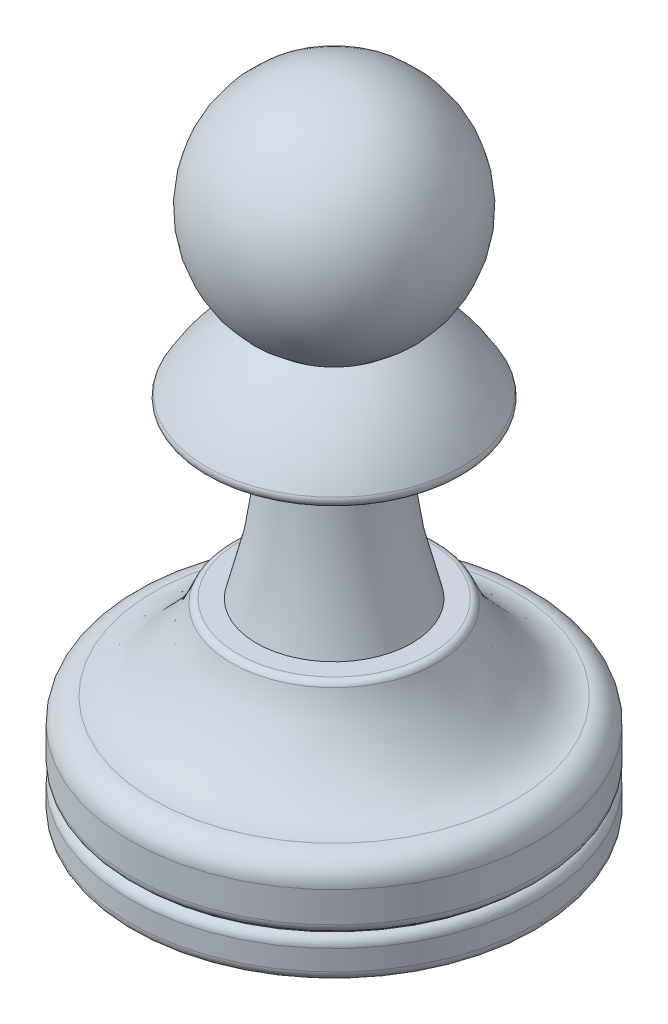
ISO-10303-21;
HEADER;
FILE_DESCRIPTION(('STEP AP214'),'2;1');
FILE_NAME('part.step','',(''),(''),'','','');
FILE_SCHEMA(('AUTOMOTIVE_DESIGN { 1 0 10303 214 1 1 1 1 }'));
ENDSEC;
DATA;
#1=APPLICATION_CONTEXT('core data for automotive mechanical design processes');
#2=APPLICATION_PROTOCOL_DEFINITION('international standard','automotive_design',2000,#1);
#3=PRODUCT_CONTEXT('',#1,'mechanical');
#4=PRODUCT('Part','Part','',(#3));
#5=PRODUCT_RELATED_PRODUCT_CATEGORY('part','',(#4));
#6=PRODUCT_DEFINITION_FORMATION('','',#4);
#7=PRODUCT_DEFINITION_CONTEXT('part definition',#1,'design');
#8=PRODUCT_DEFINITION('design','',#6,#7);
#9=PRODUCT_DEFINITION_SHAPE('','',#8);
#10=(LENGTH_UNIT() NAMED_UNIT(*) SI_UNIT(.MILLI.,.METRE.));
#11=(NAMED_UNIT(*) PLANE_ANGLE_UNIT() SI_UNIT($,.RADIAN.));
#12=(NAMED_UNIT(*) SI_UNIT($,.STERADIAN.) SOLID_ANGLE_UNIT());
#13=UNCERTAINTY_MEASURE_WITH_UNIT(LENGTH_MEASURE(1.E-05),#10,'distance_accuracy_value','');
#14=(GEOMETRIC_REPRESENTATION_CONTEXT(3) GLOBAL_UNCERTAINTY_ASSIGNED_CONTEXT((#13)) GLOBAL_UNIT_ASSIGNED_CONTEXT((#10,
#11,#12)) REPRESENTATION_CONTEXT('',''));
#15=CARTESIAN_POINT('',(0.,0.,0.));
#16=DIRECTION('',(0.,0.,1.));
#17=DIRECTION('',(1.,0.,0.));
#18=AXIS2_PLACEMENT_3D('',#15,#16,#17);
#19=CARTESIAN_POINT('',(185.56459435662,44.3493438003204,0.));
#20=DIRECTION('',(0.,-1.,0.));
#21=DIRECTION('',(1.,0.,0.));
#22=AXIS2_PLACEMENT_3D('',#19,#20,#21);
#23=SPHERICAL_SURFACE('',#22,8.509);
#24=CARTESIAN_POINT('',(185.56459435662,37.3247996146904,0.));
#25=DIRECTION('',(0.,-1.,0.));
#26=DIRECTION('',(1.,0.,0.));
#27=AXIS2_PLACEMENT_3D('',#24,#25,#26);
#28=CIRCLE('',#27,4.80196417980514);
#29=CARTESIAN_POINT('',(190.366558536425,37.3247996146904,0.));
#30=VERTEX_POINT('',#29);
#31=EDGE_CURVE('E10',#30,#30,#28,.T.);
#32=ORIENTED_EDGE('',*,*,#31,.F.);
#33=EDGE_LOOP('',(#32));
#34=FACE_BOUND('',#33,.T.);
#35=ADVANCED_FACE('F32',(#34),#23,.T.);
#36=CARTESIAN_POINT('',(185.56459435662,25.5197144004673,0.));
#37=DIRECTION('',(0.,-1.,0.));
#38=DIRECTION('',(1.,0.,0.));
#39=AXIS2_PLACEMENT_3D('',#36,#37,#38);
#40=DEGENERATE_TOROIDAL_SURFACE('',#39,2.66803334930633,13.97,.F.);
#41=CARTESIAN_POINT('',(185.56459435662,32.2623618065959,0.));
#42=DIRECTION('',(0.,-1.,0.));
#43=DIRECTION('',(1.,0.,0.));
#44=AXIS2_PLACEMENT_3D('',#41,#42,#43);
#45=CIRCLE('',#44,9.56706395135405);
#46=CARTESIAN_POINT('',(195.131658307974,32.2623618065959,0.));
#47=VERTEX_POINT('',#46);
#48=EDGE_CURVE('E38',#47,#47,#45,.T.);
#49=ORIENTED_EDGE('',*,*,#48,.F.);
#50=EDGE_LOOP('',(#49));
#51=FACE_BOUND('',#50,.T.);
#52=ORIENTED_EDGE('',*,*,#31,.T.);
#53=EDGE_LOOP('',(#52));
#54=FACE_BOUND('',#53,.T.);
#55=ADVANCED_FACE('F116',(#51,#54),#40,.F.);
#56=CARTESIAN_POINT('',(185.56459435662,32.0171746281913,0.));
#57=DIRECTION('',(0.,-1.,0.));
#58=DIRECTION('',(1.,0.,0.));
#59=AXIS2_PLACEMENT_3D('',#56,#57,#58);
#60=TOROIDAL_SURFACE('',#59,9.12215132223913,0.507999999999998);
#61=CARTESIAN_POINT('',(185.56459435662,31.5091746281913,0.));
#62=DIRECTION('',(0.,-1.,0.));
#63=DIRECTION('',(1.,0.,0.));
#64=AXIS2_PLACEMENT_3D('',#61,#62,#63);
#65=CIRCLE('',#64,9.12215132223913);
#66=CARTESIAN_POINT('',(194.686745678859,31.5091746281913,0.));
#67=VERTEX_POINT('',#66);
#68=EDGE_CURVE('E42',#67,#67,#65,.T.);
#69=ORIENTED_EDGE('',*,*,#68,.F.);
#70=EDGE_LOOP('',(#69));
#71=FACE_BOUND('',#70,.T.);
#72=ORIENTED_EDGE('',*,*,#48,.T.);
#73=EDGE_LOOP('',(#72));
#74=FACE_BOUND('',#73,.T.);
#75=ADVANCED_FACE('F113',(#71,#74),#60,.T.);
#76=CARTESIAN_POINT('',(176.442443034381,31.5091746281912,0.));
#77=DIRECTION('',(0.,1.,0.));
#78=DIRECTION('',(-1.,0.,0.));
#79=AXIS2_PLACEMENT_3D('',#76,#77,#78);
#80=PLANE('',#79);
#81=CARTESIAN_POINT('',(185.56459435662,31.5091746281913,0.));
#82=DIRECTION('',(0.,-1.,0.));
#83=DIRECTION('',(1.,0.,0.));
#84=AXIS2_PLACEMENT_3D('',#81,#82,#83);
#85=CIRCLE('',#84,3.94467986805379);
#86=CARTESIAN_POINT('',(189.509274224674,31.5091746281913,0.));
#87=VERTEX_POINT('',#86);
#88=EDGE_CURVE('E46',#87,#87,#85,.T.);
#89=ORIENTED_EDGE('',*,*,#88,.F.);
#90=EDGE_LOOP('',(#89));
#91=FACE_BOUND('',#90,.T.);
#92=ORIENTED_EDGE('',*,*,#68,.T.);
#93=EDGE_LOOP('',(#92));
#94=FACE_BOUND('',#93,.T.);
#95=ADVANCED_FACE('F109',(#91,#94),#80,.F.);
#96=CARTESIAN_POINT('',(185.56459435662,31.5091746281913,0.));
#97=DIRECTION('',(0.,-1.,0.));
#98=DIRECTION('',(1.,0.,0.));
#99=AXIS2_PLACEMENT_3D('',#96,#97,#98);
#100=TOROIDAL_SURFACE('',#99,47.1246798680538,43.18);
#101=CARTESIAN_POINT('',(185.56459435662,18.9487842387721,0.));
#102=DIRECTION('',(0.,-1.,0.));
#103=DIRECTION('',(1.,0.,0.));
#104=AXIS2_PLACEMENT_3D('',#101,#102,#103);
#105=CIRCLE('',#104,5.81186111569331);
#106=CARTESIAN_POINT('',(191.376455472314,18.9487842387721,0.));
#107=VERTEX_POINT('',#106);
#108=EDGE_CURVE('E51',#107,#107,#105,.T.);
#109=ORIENTED_EDGE('',*,*,#108,.F.);
#110=EDGE_LOOP('',(#109));
#111=FACE_BOUND('',#110,.T.);
#112=ORIENTED_EDGE('',*,*,#88,.T.);
#113=EDGE_LOOP('',(#112));
#114=FACE_BOUND('',#113,.T.);
#115=ADVANCED_FACE('F105',(#111,#114),#100,.F.);
#116=CARTESIAN_POINT('',(179.752733240927,18.9487842387723,0.));
#117=DIRECTION('',(0.,-1.,0.));
#118=DIRECTION('',(1.,0.,0.));
#119=AXIS2_PLACEMENT_3D('',#116,#117,#118);
#120=PLANE('',#119);
#121=CARTESIAN_POINT('',(185.56459435662,18.9487842387725,0.));
#122=DIRECTION('',(0.,-1.,0.));
#123=DIRECTION('',(1.,0.,0.));
#124=AXIS2_PLACEMENT_3D('',#121,#122,#123);
#125=CIRCLE('',#124,7.20397722639789);
#126=CARTESIAN_POINT('',(192.768571583018,18.9487842387725,0.));
#127=VERTEX_POINT('',#126);
#128=EDGE_CURVE('E54',#127,#127,#125,.T.);
#129=ORIENTED_EDGE('',*,*,#128,.F.);
#130=EDGE_LOOP('',(#129));
#131=FACE_BOUND('',#130,.T.);
#132=ORIENTED_EDGE('',*,*,#108,.T.);
#133=EDGE_LOOP('',(#132));
#134=FACE_BOUND('',#133,.T.);
#135=ADVANCED_FACE('F101',(#131,#134),#120,.F.);
#136=CARTESIAN_POINT('',(185.56459435662,18.4407842387725,0.));
#137=DIRECTION('',(0.,-1.,0.));
#138=DIRECTION('',(1.,0.,0.));
#139=AXIS2_PLACEMENT_3D('',#136,#137,#138);
#140=TOROIDAL_SURFACE('',#139,7.20397722639792,0.508000000000001);
#141=CARTESIAN_POINT('',(185.56459435662,18.599920026095,0.));
#142=DIRECTION('',(0.,-1.,0.));
#143=DIRECTION('',(1.,0.,0.));
#144=AXIS2_PLACEMENT_3D('',#141,#142,#143);
#145=CIRCLE('',#144,7.6864083626166);
#146=CARTESIAN_POINT('',(193.251002719237,18.599920026095,0.));
#147=VERTEX_POINT('',#146);
#148=EDGE_CURVE('E57',#147,#147,#145,.T.);
#149=ORIENTED_EDGE('',*,*,#148,.F.);
#150=EDGE_LOOP('',(#149));
#151=FACE_BOUND('',#150,.T.);
#152=ORIENTED_EDGE('',*,*,#128,.T.);
#153=EDGE_LOOP('',(#152));
#154=FACE_BOUND('',#153,.T.);
#155=ADVANCED_FACE('F96',(#151,#154),#140,.T.);
#156=CARTESIAN_POINT('',(177.878185994004,18.599920026095,0.));
#157=CARTESIAN_POINT('',(177.41597629978,17.1986993974276,0.));
#158=CARTESIAN_POINT('',(175.902471026487,14.9312493849122,0.));
#159=CARTESIAN_POINT('',(173.624638006335,12.6654787043025,0.));
#160=CARTESIAN_POINT('',(172.060560706312,12.6284920575248,0.));
#161=B_SPLINE_CURVE_WITH_KNOTS('',3,(#156,#157,#158,#159,#160),.UNSPECIFIED.,.F.,.F.,(4,1,4),
(0.0346865095038026,0.457601346104702,0.915202692209404),.UNSPECIFIED.);
#162=CARTESIAN_POINT('',(185.56459435662,4.75498898516685,0.));
#163=DIRECTION('',(0.,-1.,0.));
#164=AXIS1_PLACEMENT('',#162,#163);
#165=SURFACE_OF_REVOLUTION('',#161,#164);
#166=CARTESIAN_POINT('',(185.56459435662,12.6284920575248,0.));
#167=DIRECTION('',(0.,-1.,0.));
#168=DIRECTION('',(1.,0.,0.));
#169=AXIS2_PLACEMENT_3D('',#166,#167,#168);
#170=CIRCLE('',#169,13.5040336503079);
#171=CARTESIAN_POINT('',(199.068628006928,12.6284920575248,0.));
#172=VERTEX_POINT('',#171);
#173=EDGE_CURVE('E60',#172,#172,#170,.T.);
#174=ORIENTED_EDGE('',*,*,#173,.F.);
#175=EDGE_LOOP('',(#174));
#176=FACE_BOUND('',#175,.T.);
#177=ORIENTED_EDGE('',*,*,#148,.T.);
#178=EDGE_LOOP('',(#177));
#179=FACE_BOUND('',#178,.T.);
#180=ADVANCED_FACE('F91',(#176,#179),#165,.T.);
#181=CARTESIAN_POINT('',(185.56459435662,10.8509889851669,0.));
#182=DIRECTION('',(0.,-1.,0.));
#183=DIRECTION('',(1.,0.,0.));
#184=AXIS2_PLACEMENT_3D('',#181,#182,#183);
#185=TOROIDAL_SURFACE('',#184,13.462,1.77799999999999);
#186=CARTESIAN_POINT('',(185.56459435662,10.8509889851669,0.));
#187=DIRECTION('',(0.,-1.,0.));
#188=DIRECTION('',(1.,0.,0.));
#189=AXIS2_PLACEMENT_3D('',#186,#187,#188);
#190=CIRCLE('',#189,15.24);
#191=CARTESIAN_POINT('',(200.80459435662,10.8509889851669,0.));
#192=VERTEX_POINT('',#191);
#193=EDGE_CURVE('E63',#192,#192,#190,.T.);
#194=ORIENTED_EDGE('',*,*,#193,.F.);
#195=EDGE_LOOP('',(#194));
#196=FACE_BOUND('',#195,.T.);
#197=ORIENTED_EDGE('',*,*,#173,.T.);
#198=EDGE_LOOP('',(#197));
#199=FACE_BOUND('',#198,.T.);
#200=ADVANCED_FACE('F95',(#196,#199),#185,.T.);
#201=CARTESIAN_POINT('',(185.56459435662,4.75498898516685,0.));
#202=DIRECTION('',(0.,-1.,0.));
#203=DIRECTION('',(1.,0.,0.));
#204=AXIS2_PLACEMENT_3D('',#201,#202,#203);
#205=CYLINDRICAL_SURFACE('',#204,15.24);
#206=CARTESIAN_POINT('',(185.56459435662,8.56498898516686,0.));
#207=DIRECTION('',(0.,-1.,0.));
#208=DIRECTION('',(1.,0.,0.));
#209=AXIS2_PLACEMENT_3D('',#206,#207,#208);
#210=CIRCLE('',#209,15.24);
#211=CARTESIAN_POINT('',(200.80459435662,8.56498898516687,0.));
#212=VERTEX_POINT('',#211);
#213=EDGE_CURVE('E66',#212,#212,#210,.T.);
#214=ORIENTED_EDGE('',*,*,#213,.F.);
#215=EDGE_LOOP('',(#214));
#216=FACE_BOUND('',#215,.T.);
#217=ORIENTED_EDGE('',*,*,#193,.T.);
#218=EDGE_LOOP('',(#217));
#219=FACE_BOUND('',#218,.T.);
#220=ADVANCED_FACE('F178',(#216,#219),#205,.T.);
#221=CARTESIAN_POINT('',(185.56459435662,8.56498898516686,0.));
#222=DIRECTION('',(0.,-1.,0.));
#223=DIRECTION('',(1.,0.,0.));
#224=AXIS2_PLACEMENT_3D('',#221,#222,#223);
#225=TOROIDAL_SURFACE('',#224,14.478,0.762000000000007);
#226=CARTESIAN_POINT('',(185.56459435662,7.84656849548132,0.));
#227=DIRECTION('',(0.,-1.,0.));
#228=DIRECTION('',(1.,0.,0.));
#229=AXIS2_PLACEMENT_3D('',#226,#227,#228);
#230=CIRCLE('',#229,14.732);
#231=CARTESIAN_POINT('',(200.29659435662,7.84656849548133,0.));
#232=VERTEX_POINT('',#231);
#233=EDGE_CURVE('E69',#232,#232,#230,.T.);
#234=ORIENTED_EDGE('',*,*,#233,.F.);
#235=EDGE_LOOP('',(#234));
#236=FACE_BOUND('',#235,.T.);
#237=ORIENTED_EDGE('',*,*,#213,.T.);
#238=EDGE_LOOP('',(#237));
#239=FACE_BOUND('',#238,.T.);
#240=ADVANCED_FACE('F187',(#236,#239),#225,.T.);
#241=CARTESIAN_POINT('',(185.56459435662,4.75498898516685,0.));
#242=DIRECTION('',(0.,-1.,0.));
#243=DIRECTION('',(1.,0.,0.));
#244=AXIS2_PLACEMENT_3D('',#241,#242,#243);
#245=CYLINDRICAL_SURFACE('',#244,14.732);
#246=CARTESIAN_POINT('',(185.56459435662,7.7594094748524,0.));
#247=DIRECTION('',(0.,-1.,0.));
#248=DIRECTION('',(1.,0.,0.));
#249=AXIS2_PLACEMENT_3D('',#246,#247,#248);
#250=CIRCLE('',#249,14.732);
#251=CARTESIAN_POINT('',(200.29659435662,7.75940947485241,0.));
#252=VERTEX_POINT('',#251);
#253=EDGE_CURVE('E72',#252,#252,#250,.T.);
#254=ORIENTED_EDGE('',*,*,#253,.F.);
#255=EDGE_LOOP('',(#254));
#256=FACE_BOUND('',#255,.T.);
#257=ORIENTED_EDGE('',*,*,#233,.T.);
#258=EDGE_LOOP('',(#257));
#259=FACE_BOUND('',#258,.T.);
#260=ADVANCED_FACE('F196',(#256,#259),#245,.T.);
#261=CARTESIAN_POINT('',(185.56459435662,7.04098898516686,0.));
#262=DIRECTION('',(0.,-1.,0.));
#263=DIRECTION('',(1.,0.,0.));
#264=AXIS2_PLACEMENT_3D('',#261,#262,#263);
#265=TOROIDAL_SURFACE('',#264,14.478,0.762000000000006);
#266=CARTESIAN_POINT('',(185.56459435662,7.04098898516686,0.));
#267=DIRECTION('',(0.,-1.,0.));
#268=DIRECTION('',(1.,0.,0.));
#269=AXIS2_PLACEMENT_3D('',#266,#267,#268);
#270=CIRCLE('',#269,15.24);
#271=CARTESIAN_POINT('',(200.80459435662,7.04098898516687,0.));
#272=VERTEX_POINT('',#271);
#273=EDGE_CURVE('E75',#272,#272,#270,.T.);
#274=ORIENTED_EDGE('',*,*,#273,.F.);
#275=EDGE_LOOP('',(#274));
#276=FACE_BOUND('',#275,.T.);
#277=ORIENTED_EDGE('',*,*,#253,.T.);
#278=EDGE_LOOP('',(#277));
#279=FACE_BOUND('',#278,.T.);
#280=ADVANCED_FACE('F206',(#276,#279),#265,.T.);
#281=CARTESIAN_POINT('',(185.56459435662,4.75498898516685,0.));
#282=DIRECTION('',(0.,-1.,0.));
#283=DIRECTION('',(1.,0.,0.));
#284=AXIS2_PLACEMENT_3D('',#281,#282,#283);
#285=CYLINDRICAL_SURFACE('',#284,15.24);
#286=CARTESIAN_POINT('',(185.56459435662,5.51698898516686,0.));
#287=DIRECTION('',(0.,-1.,0.));
#288=DIRECTION('',(1.,0.,0.));
#289=AXIS2_PLACEMENT_3D('',#286,#287,#288);
#290=CIRCLE('',#289,15.24);
#291=CARTESIAN_POINT('',(200.80459435662,5.51698898516687,0.));
#292=VERTEX_POINT('',#291);
#293=EDGE_CURVE('E78',#292,#292,#290,.T.);
#294=ORIENTED_EDGE('',*,*,#293,.F.);
#295=EDGE_LOOP('',(#294));
#296=FACE_BOUND('',#295,.T.);
#297=ORIENTED_EDGE('',*,*,#273,.T.);
#298=EDGE_LOOP('',(#297));
#299=FACE_BOUND('',#298,.T.);
#300=ADVANCED_FACE('F216',(#296,#299),#285,.T.);
#301=CARTESIAN_POINT('',(185.56459435662,5.51698898516686,0.));
#302=DIRECTION('',(0.,-1.,0.));
#303=DIRECTION('',(1.,0.,0.));
#304=AXIS2_PLACEMENT_3D('',#301,#302,#303);
#305=TOROIDAL_SURFACE('',#304,14.478,0.761999999999992);
#306=CARTESIAN_POINT('',(185.56459435662,4.75498898516686,0.));
#307=DIRECTION('',(0.,-1.,0.));
#308=DIRECTION('',(1.,0.,0.));
#309=AXIS2_PLACEMENT_3D('',#306,#307,#308);
#310=CIRCLE('',#309,14.478);
#311=CARTESIAN_POINT('',(200.04259435662,4.75498898516687,0.));
#312=VERTEX_POINT('',#311);
#313=EDGE_CURVE('E81',#312,#312,#310,.T.);
#314=ORIENTED_EDGE('',*,*,#313,.F.);
#315=EDGE_LOOP('',(#314));
#316=FACE_BOUND('',#315,.T.);
#317=ORIENTED_EDGE('',*,*,#293,.T.);
#318=EDGE_LOOP('',(#317));
#319=FACE_BOUND('',#318,.T.);
#320=ADVANCED_FACE('F226',(#316,#319),#305,.T.);
#321=CARTESIAN_POINT('',(185.56459435662,4.75498898516686,0.));
#322=DIRECTION('',(0.,1.,0.));
#323=DIRECTION('',(-1.,0.,0.));
#324=AXIS2_PLACEMENT_3D('',#321,#322,#323);
#325=PLANE('',#324);
#326=ORIENTED_EDGE('',*,*,#313,.T.);
#327=EDGE_LOOP('',(#326));
#328=FACE_BOUND('',#327,.T.);
#329=ADVANCED_FACE('F236',(#328),#325,.F.);
#330=CLOSED_SHELL('',(#35,#55,#75,#95,#115,#135,#155,#180,#200,#220,#240,#260,#280,#300,#320,#329));
#331=MANIFOLD_SOLID_BREP('B2',#330);
#332=ADVANCED_BREP_SHAPE_REPRESENTATION('',(#18,#331),#14);
#333=SHAPE_DEFINITION_REPRESENTATION(#9,#332);
ENDSEC;
END-ISO-10303-21;
